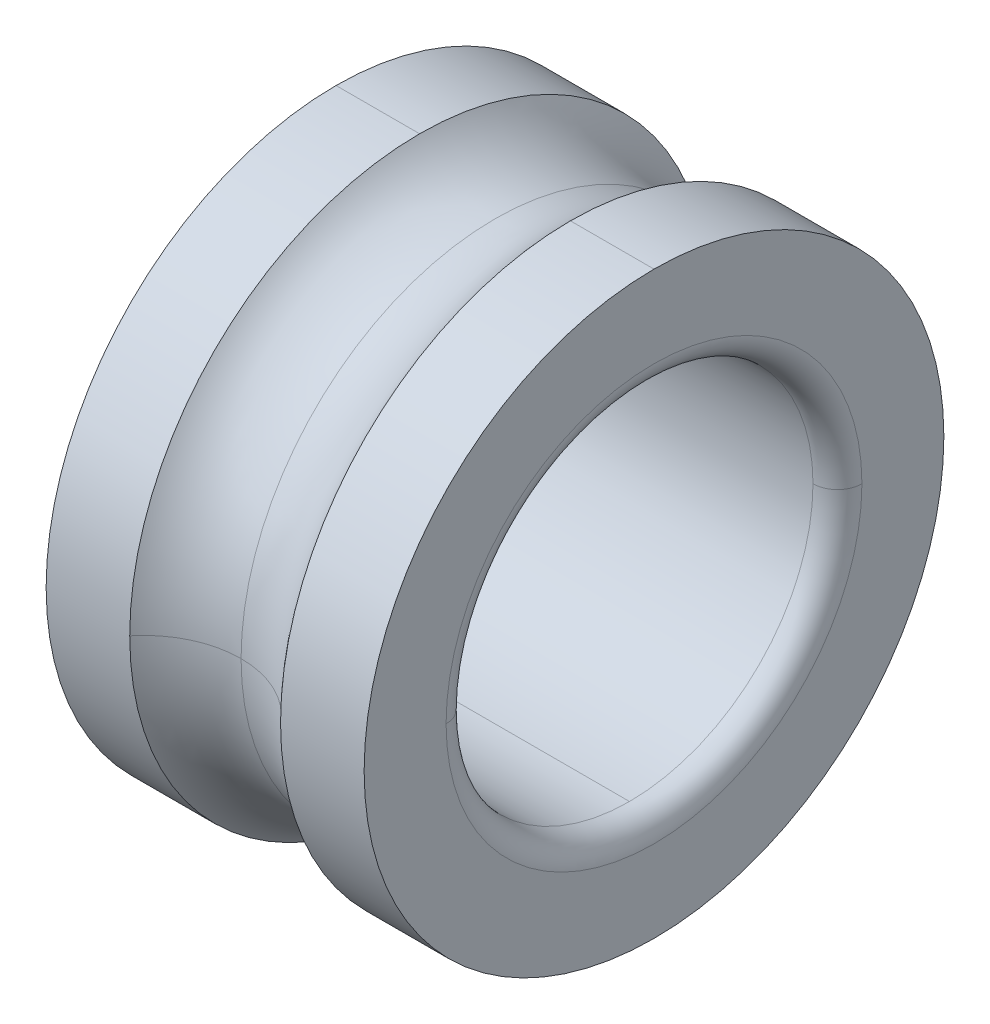
ISO-10303-21;
HEADER;
FILE_DESCRIPTION(('STEP AP214'),'2;1');
FILE_NAME('part.step','',(''),(''),'','','');
FILE_SCHEMA(('AUTOMOTIVE_DESIGN { 1 0 10303 214 1 1 1 1 }'));
ENDSEC;
DATA;
#1=APPLICATION_CONTEXT('core data for automotive mechanical design processes');
#2=APPLICATION_PROTOCOL_DEFINITION('international standard','automotive_design',2000,#1);
#3=PRODUCT_CONTEXT('',#1,'mechanical');
#4=PRODUCT('Part','Part','',(#3));
#5=PRODUCT_RELATED_PRODUCT_CATEGORY('part','',(#4));
#6=PRODUCT_DEFINITION_FORMATION('','',#4);
#7=PRODUCT_DEFINITION_CONTEXT('part definition',#1,'design');
#8=PRODUCT_DEFINITION('design','',#6,#7);
#9=PRODUCT_DEFINITION_SHAPE('','',#8);
#10=(LENGTH_UNIT() NAMED_UNIT(*) SI_UNIT(.MILLI.,.METRE.));
#11=(NAMED_UNIT(*) PLANE_ANGLE_UNIT() SI_UNIT($,.RADIAN.));
#12=(NAMED_UNIT(*) SI_UNIT($,.STERADIAN.) SOLID_ANGLE_UNIT());
#13=UNCERTAINTY_MEASURE_WITH_UNIT(LENGTH_MEASURE(1.E-05),#10,'distance_accuracy_value','');
#14=(GEOMETRIC_REPRESENTATION_CONTEXT(3) GLOBAL_UNCERTAINTY_ASSIGNED_CONTEXT((#13)) GLOBAL_UNIT_ASSIGNED_CONTEXT((#10,
#11,#12)) REPRESENTATION_CONTEXT('',''));
#15=CARTESIAN_POINT('',(0.,0.,0.));
#16=DIRECTION('',(0.,0.,1.));
#17=DIRECTION('',(1.,0.,0.));
#18=AXIS2_PLACEMENT_3D('',#15,#16,#17);
#19=CARTESIAN_POINT('',(11.2913436508449,0.,0.));
#20=DIRECTION('',(1.,0.,0.));
#21=DIRECTION('',(0.,1.,0.));
#22=AXIS2_PLACEMENT_3D('',#19,#20,#21);
#23=CYLINDRICAL_SURFACE('',#22,11.85);
#24=DIRECTION('',(1.,0.,0.));
#25=VECTOR('',#24,1.);
#26=CARTESIAN_POINT('',(11.2913436508449,11.85,0.));
#27=LINE('',#26,#25);
#28=CARTESIAN_POINT('',(9.58268730168988,11.85,0.));
#29=VERTEX_POINT('',#28);
#30=CARTESIAN_POINT('',(13.,11.85,0.));
#31=VERTEX_POINT('',#30);
#32=EDGE_CURVE('E141',#29,#31,#27,.T.);
#33=ORIENTED_EDGE('',*,*,#32,.T.);
#34=CARTESIAN_POINT('',(13.,0.,0.));
#35=DIRECTION('',(1.,0.,0.));
#36=DIRECTION('',(0.,1.,0.));
#37=AXIS2_PLACEMENT_3D('',#34,#35,#36);
#38=CIRCLE('',#37,11.85);
#39=CARTESIAN_POINT('',(13.,-11.85,0.));
#40=VERTEX_POINT('',#39);
#41=EDGE_CURVE('E111',#40,#31,#38,.T.);
#42=ORIENTED_EDGE('',*,*,#41,.F.);
#43=DIRECTION('',(-1.,0.,0.));
#44=VECTOR('',#43,1.);
#45=CARTESIAN_POINT('',(11.2913436508449,-11.85,0.));
#46=LINE('',#45,#44);
#47=CARTESIAN_POINT('',(9.58268730168988,-11.85,0.));
#48=VERTEX_POINT('',#47);
#49=EDGE_CURVE('E157',#40,#48,#46,.T.);
#50=ORIENTED_EDGE('',*,*,#49,.T.);
#51=CARTESIAN_POINT('',(9.58268730168988,0.,0.));
#52=DIRECTION('',(1.,0.,0.));
#53=DIRECTION('',(0.,1.,0.));
#54=AXIS2_PLACEMENT_3D('',#51,#52,#53);
#55=CIRCLE('',#54,11.85);
#56=CARTESIAN_POINT('',(9.58268730168988,0.,-11.85));
#57=VERTEX_POINT('',#56);
#58=EDGE_CURVE('E132',#48,#57,#55,.T.);
#59=ORIENTED_EDGE('',*,*,#58,.T.);
#60=CARTESIAN_POINT('',(9.58268730168988,0.,0.));
#61=DIRECTION('',(1.,0.,0.));
#62=DIRECTION('',(0.,1.,0.));
#63=AXIS2_PLACEMENT_3D('',#60,#61,#62);
#64=CIRCLE('',#63,11.85);
#65=EDGE_CURVE('E138',#57,#29,#64,.T.);
#66=ORIENTED_EDGE('',*,*,#65,.T.);
#67=EDGE_LOOP('',(#33,#42,#50,#59,#66));
#68=FACE_BOUND('',#67,.T.);
#69=ADVANCED_FACE('F16',(#68),#23,.T.);
#70=CARTESIAN_POINT('',(6.5,0.,0.));
#71=DIRECTION('',(1.,0.,0.));
#72=DIRECTION('',(0.,0.,-1.));
#73=AXIS2_PLACEMENT_3D('',#70,#71,#72);
#74=TOROIDAL_SURFACE('',#73,14.35,3.969);
#75=CARTESIAN_POINT('',(6.5,0.,0.));
#76=DIRECTION('',(-1.,0.,0.));
#77=DIRECTION('',(0.,0.,1.));
#78=AXIS2_PLACEMENT_3D('',#75,#76,#77);
#79=CIRCLE('',#78,10.381);
#80=CARTESIAN_POINT('',(6.5,0.,10.381));
#81=VERTEX_POINT('',#80);
#82=CARTESIAN_POINT('',(6.5,0.,-10.381));
#83=VERTEX_POINT('',#82);
#84=EDGE_CURVE('E127',#81,#83,#79,.T.);
#85=ORIENTED_EDGE('',*,*,#84,.T.);
#86=CARTESIAN_POINT('',(6.5,0.,-14.35));
#87=DIRECTION('',(0.,-1.,0.));
#88=DIRECTION('',(0.,0.,-1.));
#89=AXIS2_PLACEMENT_3D('',#86,#87,#88);
#90=CIRCLE('',#89,3.969);
#91=CARTESIAN_POINT('',(3.41731269831012,0.,-11.85));
#92=VERTEX_POINT('',#91);
#93=EDGE_CURVE('E148',#83,#92,#90,.T.);
#94=ORIENTED_EDGE('',*,*,#93,.T.);
#95=CARTESIAN_POINT('',(3.41731269831013,0.,0.));
#96=DIRECTION('',(1.,0.,0.));
#97=DIRECTION('',(0.,1.,0.));
#98=AXIS2_PLACEMENT_3D('',#95,#96,#97);
#99=CIRCLE('',#98,11.85);
#100=CARTESIAN_POINT('',(3.41731269831013,11.85,0.));
#101=VERTEX_POINT('',#100);
#102=EDGE_CURVE('E11',#92,#101,#99,.T.);
#103=ORIENTED_EDGE('',*,*,#102,.T.);
#104=CARTESIAN_POINT('',(3.41731269831013,0.,0.));
#105=DIRECTION('',(1.,0.,0.));
#106=DIRECTION('',(0.,1.,0.));
#107=AXIS2_PLACEMENT_3D('',#104,#105,#106);
#108=CIRCLE('',#107,11.85);
#109=CARTESIAN_POINT('',(3.41731269831012,0.,11.85));
#110=VERTEX_POINT('',#109);
#111=EDGE_CURVE('E184',#101,#110,#108,.T.);
#112=ORIENTED_EDGE('',*,*,#111,.T.);
#113=CARTESIAN_POINT('',(6.5,0.,14.35));
#114=DIRECTION('',(0.,-1.,0.));
#115=DIRECTION('',(0.,0.,1.));
#116=AXIS2_PLACEMENT_3D('',#113,#114,#115);
#117=CIRCLE('',#116,3.969);
#118=EDGE_CURVE('E156',#110,#81,#117,.T.);
#119=ORIENTED_EDGE('',*,*,#118,.T.);
#120=EDGE_LOOP('',(#85,#94,#103,#112,#119));
#121=FACE_BOUND('',#120,.T.);
#122=ADVANCED_FACE('F226',(#121),#74,.F.);
#123=CARTESIAN_POINT('',(1.70865634915506,0.,0.));
#124=DIRECTION('',(1.,0.,0.));
#125=DIRECTION('',(0.,1.,0.));
#126=AXIS2_PLACEMENT_3D('',#123,#124,#125);
#127=CYLINDRICAL_SURFACE('',#126,11.85);
#128=DIRECTION('',(1.,0.,0.));
#129=VECTOR('',#128,1.);
#130=CARTESIAN_POINT('',(1.70865634915506,11.85,0.));
#131=LINE('',#130,#129);
#132=CARTESIAN_POINT('',(0.,11.85,0.));
#133=VERTEX_POINT('',#132);
#134=EDGE_CURVE('E145',#133,#101,#131,.T.);
#135=ORIENTED_EDGE('',*,*,#134,.T.);
#136=ORIENTED_EDGE('',*,*,#102,.F.);
#137=CARTESIAN_POINT('',(3.41731269831013,0.,0.));
#138=DIRECTION('',(1.,0.,0.));
#139=DIRECTION('',(0.,1.,0.));
#140=AXIS2_PLACEMENT_3D('',#137,#138,#139);
#141=CIRCLE('',#140,11.85);
#142=CARTESIAN_POINT('',(3.41731269831013,-11.85,0.));
#143=VERTEX_POINT('',#142);
#144=EDGE_CURVE('E155',#143,#92,#141,.T.);
#145=ORIENTED_EDGE('',*,*,#144,.F.);
#146=DIRECTION('',(-1.,0.,0.));
#147=VECTOR('',#146,1.);
#148=CARTESIAN_POINT('',(1.70865634915506,-11.85,0.));
#149=LINE('',#148,#147);
#150=CARTESIAN_POINT('',(0.,-11.85,0.));
#151=VERTEX_POINT('',#150);
#152=EDGE_CURVE('E181',#143,#151,#149,.T.);
#153=ORIENTED_EDGE('',*,*,#152,.T.);
#154=CARTESIAN_POINT('',(0.,0.,0.));
#155=DIRECTION('',(1.,0.,0.));
#156=DIRECTION('',(0.,1.,0.));
#157=AXIS2_PLACEMENT_3D('',#154,#155,#156);
#158=CIRCLE('',#157,11.85);
#159=EDGE_CURVE('E24',#151,#133,#158,.T.);
#160=ORIENTED_EDGE('',*,*,#159,.T.);
#161=EDGE_LOOP('',(#135,#136,#145,#153,#160));
#162=FACE_BOUND('',#161,.T.);
#163=ADVANCED_FACE('F214',(#162),#127,.T.);
#164=CARTESIAN_POINT('',(0.,10.175,0.));
#165=DIRECTION('',(-1.,0.,0.));
#166=DIRECTION('',(0.,0.,1.));
#167=AXIS2_PLACEMENT_3D('',#164,#165,#166);
#168=PLANE('',#167);
#169=CARTESIAN_POINT('',(0.,0.,0.));
#170=DIRECTION('',(1.,0.,0.));
#171=DIRECTION('',(0.,1.,0.));
#172=AXIS2_PLACEMENT_3D('',#169,#170,#171);
#173=CIRCLE('',#172,8.5);
#174=CARTESIAN_POINT('',(0.,0.,8.5));
#175=VERTEX_POINT('',#174);
#176=CARTESIAN_POINT('',(0.,0.,-8.5));
#177=VERTEX_POINT('',#176);
#178=EDGE_CURVE('E210',#175,#177,#173,.T.);
#179=ORIENTED_EDGE('',*,*,#178,.T.);
#180=CARTESIAN_POINT('',(0.,0.,0.));
#181=DIRECTION('',(1.,0.,0.));
#182=DIRECTION('',(0.,1.,0.));
#183=AXIS2_PLACEMENT_3D('',#180,#181,#182);
#184=CIRCLE('',#183,8.5);
#185=EDGE_CURVE('E193',#177,#175,#184,.T.);
#186=ORIENTED_EDGE('',*,*,#185,.T.);
#187=EDGE_LOOP('',(#179,#186));
#188=FACE_BOUND('',#187,.T.);
#189=CARTESIAN_POINT('',(0.,0.,0.));
#190=DIRECTION('',(1.,0.,0.));
#191=DIRECTION('',(0.,1.,0.));
#192=AXIS2_PLACEMENT_3D('',#189,#190,#191);
#193=CIRCLE('',#192,11.85);
#194=EDGE_CURVE('E147',#133,#151,#193,.T.);
#195=ORIENTED_EDGE('',*,*,#194,.F.);
#196=ORIENTED_EDGE('',*,*,#159,.F.);
#197=EDGE_LOOP('',(#195,#196));
#198=FACE_BOUND('',#197,.T.);
#199=ADVANCED_FACE('F218',(#188,#198),#168,.T.);
#200=CARTESIAN_POINT('',(1.,0.,0.));
#201=DIRECTION('',(1.,0.,0.));
#202=DIRECTION('',(0.,0.,-1.));
#203=AXIS2_PLACEMENT_3D('',#200,#201,#202);
#204=TOROIDAL_SURFACE('',#203,8.5,1.);
#205=CARTESIAN_POINT('',(1.,0.,-8.5));
#206=DIRECTION('',(0.,-1.,0.));
#207=DIRECTION('',(0.,0.,-1.));
#208=AXIS2_PLACEMENT_3D('',#205,#206,#207);
#209=CIRCLE('',#208,1.);
#210=CARTESIAN_POINT('',(1.,0.,-7.5));
#211=VERTEX_POINT('',#210);
#212=EDGE_CURVE('E186',#211,#177,#209,.T.);
#213=ORIENTED_EDGE('',*,*,#212,.T.);
#214=ORIENTED_EDGE('',*,*,#178,.F.);
#215=CARTESIAN_POINT('',(1.,0.,8.5));
#216=DIRECTION('',(0.,-1.,0.));
#217=DIRECTION('',(0.,0.,1.));
#218=AXIS2_PLACEMENT_3D('',#215,#216,#217);
#219=CIRCLE('',#218,1.);
#220=CARTESIAN_POINT('',(1.,0.,7.5));
#221=VERTEX_POINT('',#220);
#222=EDGE_CURVE('E173',#175,#221,#219,.T.);
#223=ORIENTED_EDGE('',*,*,#222,.T.);
#224=CARTESIAN_POINT('',(1.,0.,0.));
#225=DIRECTION('',(1.,0.,0.));
#226=DIRECTION('',(0.,1.,0.));
#227=AXIS2_PLACEMENT_3D('',#224,#225,#226);
#228=CIRCLE('',#227,7.5);
#229=CARTESIAN_POINT('',(1.,-7.5,0.));
#230=VERTEX_POINT('',#229);
#231=EDGE_CURVE('E208',#221,#230,#228,.T.);
#232=ORIENTED_EDGE('',*,*,#231,.T.);
#233=CARTESIAN_POINT('',(1.,0.,0.));
#234=DIRECTION('',(1.,0.,0.));
#235=DIRECTION('',(0.,1.,0.));
#236=AXIS2_PLACEMENT_3D('',#233,#234,#235);
#237=CIRCLE('',#236,7.5);
#238=EDGE_CURVE('E199',#230,#211,#237,.T.);
#239=ORIENTED_EDGE('',*,*,#238,.T.);
#240=EDGE_LOOP('',(#213,#214,#223,#232,#239));
#241=FACE_BOUND('',#240,.T.);
#242=ADVANCED_FACE('F269',(#241),#204,.T.);
#243=CARTESIAN_POINT('',(6.5,0.,0.));
#244=DIRECTION('',(1.,0.,0.));
#245=DIRECTION('',(0.,1.,0.));
#246=AXIS2_PLACEMENT_3D('',#243,#244,#245);
#247=CYLINDRICAL_SURFACE('',#246,7.5);
#248=DIRECTION('',(1.,0.,0.));
#249=VECTOR('',#248,1.);
#250=CARTESIAN_POINT('',(6.5,7.5,0.));
#251=LINE('',#250,#249);
#252=CARTESIAN_POINT('',(1.,7.5,0.));
#253=VERTEX_POINT('',#252);
#254=CARTESIAN_POINT('',(12.,7.5,0.));
#255=VERTEX_POINT('',#254);
#256=EDGE_CURVE('E196',#253,#255,#251,.T.);
#257=ORIENTED_EDGE('',*,*,#256,.T.);
#258=CARTESIAN_POINT('',(12.,0.,0.));
#259=DIRECTION('',(1.,0.,0.));
#260=DIRECTION('',(0.,1.,0.));
#261=AXIS2_PLACEMENT_3D('',#258,#259,#260);
#262=CIRCLE('',#261,7.5);
#263=CARTESIAN_POINT('',(12.,0.,7.5));
#264=VERTEX_POINT('',#263);
#265=EDGE_CURVE('E204',#255,#264,#262,.T.);
#266=ORIENTED_EDGE('',*,*,#265,.T.);
#267=CARTESIAN_POINT('',(12.,0.,0.));
#268=DIRECTION('',(1.,0.,0.));
#269=DIRECTION('',(0.,1.,0.));
#270=AXIS2_PLACEMENT_3D('',#267,#268,#269);
#271=CIRCLE('',#270,7.5);
#272=CARTESIAN_POINT('',(12.,-7.5,0.));
#273=VERTEX_POINT('',#272);
#274=EDGE_CURVE('E32',#264,#273,#271,.T.);
#275=ORIENTED_EDGE('',*,*,#274,.T.);
#276=DIRECTION('',(-1.,0.,0.));
#277=VECTOR('',#276,1.);
#278=CARTESIAN_POINT('',(6.5,-7.5,0.));
#279=LINE('',#278,#277);
#280=EDGE_CURVE('E161',#273,#230,#279,.T.);
#281=ORIENTED_EDGE('',*,*,#280,.T.);
#282=ORIENTED_EDGE('',*,*,#231,.F.);
#283=CARTESIAN_POINT('',(1.,0.,0.));
#284=DIRECTION('',(1.,0.,0.));
#285=DIRECTION('',(0.,1.,0.));
#286=AXIS2_PLACEMENT_3D('',#283,#284,#285);
#287=CIRCLE('',#286,7.5);
#288=EDGE_CURVE('E170',#253,#221,#287,.T.);
#289=ORIENTED_EDGE('',*,*,#288,.F.);
#290=EDGE_LOOP('',(#257,#266,#275,#281,#282,#289));
#291=FACE_BOUND('',#290,.T.);
#292=ADVANCED_FACE('F254',(#291),#247,.F.);
#293=CARTESIAN_POINT('',(12.,0.,0.));
#294=DIRECTION('',(1.,0.,0.));
#295=DIRECTION('',(0.,0.,-1.));
#296=AXIS2_PLACEMENT_3D('',#293,#294,#295);
#297=TOROIDAL_SURFACE('',#296,8.5,1.);
#298=CARTESIAN_POINT('',(12.,0.,-8.5));
#299=DIRECTION('',(0.,-1.,0.));
#300=DIRECTION('',(0.,0.,-1.));
#301=AXIS2_PLACEMENT_3D('',#298,#299,#300);
#302=CIRCLE('',#301,1.);
#303=CARTESIAN_POINT('',(13.,0.,-8.5));
#304=VERTEX_POINT('',#303);
#305=CARTESIAN_POINT('',(12.,0.,-7.5));
#306=VERTEX_POINT('',#305);
#307=EDGE_CURVE('E102',#304,#306,#302,.T.);
#308=ORIENTED_EDGE('',*,*,#307,.T.);
#309=CARTESIAN_POINT('',(12.,0.,0.));
#310=DIRECTION('',(1.,0.,0.));
#311=DIRECTION('',(0.,1.,0.));
#312=AXIS2_PLACEMENT_3D('',#309,#310,#311);
#313=CIRCLE('',#312,7.5);
#314=EDGE_CURVE('E123',#273,#306,#313,.T.);
#315=ORIENTED_EDGE('',*,*,#314,.F.);
#316=ORIENTED_EDGE('',*,*,#274,.F.);
#317=CARTESIAN_POINT('',(12.,0.,8.5));
#318=DIRECTION('',(0.,-1.,0.));
#319=DIRECTION('',(0.,0.,1.));
#320=AXIS2_PLACEMENT_3D('',#317,#318,#319);
#321=CIRCLE('',#320,1.);
#322=CARTESIAN_POINT('',(13.,0.,8.5));
#323=VERTEX_POINT('',#322);
#324=EDGE_CURVE('E108',#264,#323,#321,.T.);
#325=ORIENTED_EDGE('',*,*,#324,.T.);
#326=CARTESIAN_POINT('',(13.,0.,0.));
#327=DIRECTION('',(1.,0.,0.));
#328=DIRECTION('',(0.,1.,0.));
#329=AXIS2_PLACEMENT_3D('',#326,#327,#328);
#330=CIRCLE('',#329,8.5);
#331=EDGE_CURVE('E104',#323,#304,#330,.T.);
#332=ORIENTED_EDGE('',*,*,#331,.T.);
#333=EDGE_LOOP('',(#308,#315,#316,#325,#332));
#334=FACE_BOUND('',#333,.T.);
#335=ADVANCED_FACE('F106',(#334),#297,.T.);
#336=CARTESIAN_POINT('',(13.,10.175,0.));
#337=DIRECTION('',(1.,0.,0.));
#338=DIRECTION('',(0.,1.,0.));
#339=AXIS2_PLACEMENT_3D('',#336,#337,#338);
#340=PLANE('',#339);
#341=CARTESIAN_POINT('',(13.,0.,0.));
#342=DIRECTION('',(1.,0.,0.));
#343=DIRECTION('',(0.,1.,0.));
#344=AXIS2_PLACEMENT_3D('',#341,#342,#343);
#345=CIRCLE('',#344,8.5);
#346=EDGE_CURVE('E113',#304,#323,#345,.T.);
#347=ORIENTED_EDGE('',*,*,#346,.F.);
#348=ORIENTED_EDGE('',*,*,#331,.F.);
#349=EDGE_LOOP('',(#347,#348));
#350=FACE_BOUND('',#349,.T.);
#351=CARTESIAN_POINT('',(13.,0.,0.));
#352=DIRECTION('',(1.,0.,0.));
#353=DIRECTION('',(0.,1.,0.));
#354=AXIS2_PLACEMENT_3D('',#351,#352,#353);
#355=CIRCLE('',#354,11.85);
#356=EDGE_CURVE('E159',#31,#40,#355,.T.);
#357=ORIENTED_EDGE('',*,*,#356,.T.);
#358=ORIENTED_EDGE('',*,*,#41,.T.);
#359=EDGE_LOOP('',(#357,#358));
#360=FACE_BOUND('',#359,.T.);
#361=ADVANCED_FACE('F114',(#350,#360),#340,.T.);
#362=CARTESIAN_POINT('',(12.,0.,0.));
#363=DIRECTION('',(1.,0.,0.));
#364=DIRECTION('',(0.,0.,-1.));
#365=AXIS2_PLACEMENT_3D('',#362,#363,#364);
#366=TOROIDAL_SURFACE('',#365,8.5,1.);
#367=ORIENTED_EDGE('',*,*,#307,.F.);
#368=ORIENTED_EDGE('',*,*,#346,.T.);
#369=ORIENTED_EDGE('',*,*,#324,.F.);
#370=ORIENTED_EDGE('',*,*,#265,.F.);
#371=CARTESIAN_POINT('',(12.,0.,0.));
#372=DIRECTION('',(1.,0.,0.));
#373=DIRECTION('',(0.,1.,0.));
#374=AXIS2_PLACEMENT_3D('',#371,#372,#373);
#375=CIRCLE('',#374,7.5);
#376=EDGE_CURVE('E120',#306,#255,#375,.T.);
#377=ORIENTED_EDGE('',*,*,#376,.F.);
#378=EDGE_LOOP('',(#367,#368,#369,#370,#377));
#379=FACE_BOUND('',#378,.T.);
#380=ADVANCED_FACE('F118',(#379),#366,.T.);
#381=CARTESIAN_POINT('',(6.5,0.,0.));
#382=DIRECTION('',(1.,0.,0.));
#383=DIRECTION('',(0.,1.,0.));
#384=AXIS2_PLACEMENT_3D('',#381,#382,#383);
#385=CYLINDRICAL_SURFACE('',#384,7.5);
#386=ORIENTED_EDGE('',*,*,#256,.F.);
#387=CARTESIAN_POINT('',(1.,0.,0.));
#388=DIRECTION('',(1.,0.,0.));
#389=DIRECTION('',(0.,1.,0.));
#390=AXIS2_PLACEMENT_3D('',#387,#388,#389);
#391=CIRCLE('',#390,7.5);
#392=EDGE_CURVE('E174',#211,#253,#391,.T.);
#393=ORIENTED_EDGE('',*,*,#392,.F.);
#394=ORIENTED_EDGE('',*,*,#238,.F.);
#395=ORIENTED_EDGE('',*,*,#280,.F.);
#396=ORIENTED_EDGE('',*,*,#314,.T.);
#397=ORIENTED_EDGE('',*,*,#376,.T.);
#398=EDGE_LOOP('',(#386,#393,#394,#395,#396,#397));
#399=FACE_BOUND('',#398,.T.);
#400=ADVANCED_FACE('F252',(#399),#385,.F.);
#401=CARTESIAN_POINT('',(1.,0.,0.));
#402=DIRECTION('',(1.,0.,0.));
#403=DIRECTION('',(0.,0.,-1.));
#404=AXIS2_PLACEMENT_3D('',#401,#402,#403);
#405=TOROIDAL_SURFACE('',#404,8.5,1.);
#406=ORIENTED_EDGE('',*,*,#212,.F.);
#407=ORIENTED_EDGE('',*,*,#392,.T.);
#408=ORIENTED_EDGE('',*,*,#288,.T.);
#409=ORIENTED_EDGE('',*,*,#222,.F.);
#410=ORIENTED_EDGE('',*,*,#185,.F.);
#411=EDGE_LOOP('',(#406,#407,#408,#409,#410));
#412=FACE_BOUND('',#411,.T.);
#413=ADVANCED_FACE('F275',(#412),#405,.T.);
#414=CARTESIAN_POINT('',(1.70865634915506,0.,0.));
#415=DIRECTION('',(1.,0.,0.));
#416=DIRECTION('',(0.,1.,0.));
#417=AXIS2_PLACEMENT_3D('',#414,#415,#416);
#418=CYLINDRICAL_SURFACE('',#417,11.85);
#419=ORIENTED_EDGE('',*,*,#134,.F.);
#420=ORIENTED_EDGE('',*,*,#194,.T.);
#421=ORIENTED_EDGE('',*,*,#152,.F.);
#422=CARTESIAN_POINT('',(3.41731269831013,0.,0.));
#423=DIRECTION('',(1.,0.,0.));
#424=DIRECTION('',(0.,1.,0.));
#425=AXIS2_PLACEMENT_3D('',#422,#423,#424);
#426=CIRCLE('',#425,11.85);
#427=EDGE_CURVE('E152',#110,#143,#426,.T.);
#428=ORIENTED_EDGE('',*,*,#427,.F.);
#429=ORIENTED_EDGE('',*,*,#111,.F.);
#430=EDGE_LOOP('',(#419,#420,#421,#428,#429));
#431=FACE_BOUND('',#430,.T.);
#432=ADVANCED_FACE('F221',(#431),#418,.T.);
#433=CARTESIAN_POINT('',(6.5,0.,0.));
#434=DIRECTION('',(1.,0.,0.));
#435=DIRECTION('',(0.,0.,-1.));
#436=AXIS2_PLACEMENT_3D('',#433,#434,#435);
#437=TOROIDAL_SURFACE('',#436,14.35,3.969);
#438=CARTESIAN_POINT('',(6.5,0.,0.));
#439=DIRECTION('',(-1.,0.,0.));
#440=DIRECTION('',(0.,0.,1.));
#441=AXIS2_PLACEMENT_3D('',#438,#439,#440);
#442=CIRCLE('',#441,10.381);
#443=EDGE_CURVE('E135',#83,#81,#442,.T.);
#444=ORIENTED_EDGE('',*,*,#443,.T.);
#445=ORIENTED_EDGE('',*,*,#118,.F.);
#446=ORIENTED_EDGE('',*,*,#427,.T.);
#447=ORIENTED_EDGE('',*,*,#144,.T.);
#448=ORIENTED_EDGE('',*,*,#93,.F.);
#449=EDGE_LOOP('',(#444,#445,#446,#447,#448));
#450=FACE_BOUND('',#449,.T.);
#451=ADVANCED_FACE('F228',(#450),#437,.F.);
#452=CARTESIAN_POINT('',(11.2913436508449,0.,0.));
#453=DIRECTION('',(1.,0.,0.));
#454=DIRECTION('',(0.,1.,0.));
#455=AXIS2_PLACEMENT_3D('',#452,#453,#454);
#456=CYLINDRICAL_SURFACE('',#455,11.85);
#457=ORIENTED_EDGE('',*,*,#32,.F.);
#458=CARTESIAN_POINT('',(9.58268730168988,0.,0.));
#459=DIRECTION('',(1.,0.,0.));
#460=DIRECTION('',(0.,1.,0.));
#461=AXIS2_PLACEMENT_3D('',#458,#459,#460);
#462=CIRCLE('',#461,11.85);
#463=CARTESIAN_POINT('',(9.58268730168988,0.,11.85));
#464=VERTEX_POINT('',#463);
#465=EDGE_CURVE('E131',#29,#464,#462,.T.);
#466=ORIENTED_EDGE('',*,*,#465,.T.);
#467=CARTESIAN_POINT('',(9.58268730168988,0.,0.));
#468=DIRECTION('',(1.,0.,0.));
#469=DIRECTION('',(0.,1.,0.));
#470=AXIS2_PLACEMENT_3D('',#467,#468,#469);
#471=CIRCLE('',#470,11.85);
#472=EDGE_CURVE('E134',#464,#48,#471,.T.);
#473=ORIENTED_EDGE('',*,*,#472,.T.);
#474=ORIENTED_EDGE('',*,*,#49,.F.);
#475=ORIENTED_EDGE('',*,*,#356,.F.);
#476=EDGE_LOOP('',(#457,#466,#473,#474,#475));
#477=FACE_BOUND('',#476,.T.);
#478=ADVANCED_FACE('F244',(#477),#456,.T.);
#479=CARTESIAN_POINT('',(6.5,0.,0.));
#480=DIRECTION('',(1.,0.,0.));
#481=DIRECTION('',(0.,0.,-1.));
#482=AXIS2_PLACEMENT_3D('',#479,#480,#481);
#483=TOROIDAL_SURFACE('',#482,14.35,3.969);
#484=ORIENTED_EDGE('',*,*,#443,.F.);
#485=CARTESIAN_POINT('',(6.5,0.,-14.35));
#486=DIRECTION('',(0.,-1.,0.));
#487=DIRECTION('',(0.,0.,-1.));
#488=AXIS2_PLACEMENT_3D('',#485,#486,#487);
#489=CIRCLE('',#488,3.969);
#490=EDGE_CURVE('E144',#57,#83,#489,.T.);
#491=ORIENTED_EDGE('',*,*,#490,.F.);
#492=ORIENTED_EDGE('',*,*,#58,.F.);
#493=ORIENTED_EDGE('',*,*,#472,.F.);
#494=CARTESIAN_POINT('',(6.5,0.,14.35));
#495=DIRECTION('',(0.,-1.,0.));
#496=DIRECTION('',(0.,0.,1.));
#497=AXIS2_PLACEMENT_3D('',#494,#495,#496);
#498=CIRCLE('',#497,3.969);
#499=EDGE_CURVE('E128',#81,#464,#498,.T.);
#500=ORIENTED_EDGE('',*,*,#499,.F.);
#501=EDGE_LOOP('',(#484,#491,#492,#493,#500));
#502=FACE_BOUND('',#501,.T.);
#503=ADVANCED_FACE('F234',(#502),#483,.F.);
#504=CARTESIAN_POINT('',(6.5,0.,0.));
#505=DIRECTION('',(1.,0.,0.));
#506=DIRECTION('',(0.,0.,-1.));
#507=AXIS2_PLACEMENT_3D('',#504,#505,#506);
#508=TOROIDAL_SURFACE('',#507,14.35,3.969);
#509=ORIENTED_EDGE('',*,*,#84,.F.);
#510=ORIENTED_EDGE('',*,*,#499,.T.);
#511=ORIENTED_EDGE('',*,*,#465,.F.);
#512=ORIENTED_EDGE('',*,*,#65,.F.);
#513=ORIENTED_EDGE('',*,*,#490,.T.);
#514=EDGE_LOOP('',(#509,#510,#511,#512,#513));
#515=FACE_BOUND('',#514,.T.);
#516=ADVANCED_FACE('F238',(#515),#508,.F.);
#517=CLOSED_SHELL('',(#69,#122,#163,#199,#242,#292,#335,#361,#380,#400,#413,#432,#451,#478,#503,#516));
#518=MANIFOLD_SOLID_BREP('B1',#517);
#519=ADVANCED_BREP_SHAPE_REPRESENTATION('',(#18,#518),#14);
#520=SHAPE_DEFINITION_REPRESENTATION(#9,#519);
ENDSEC;
END-ISO-10303-21;
